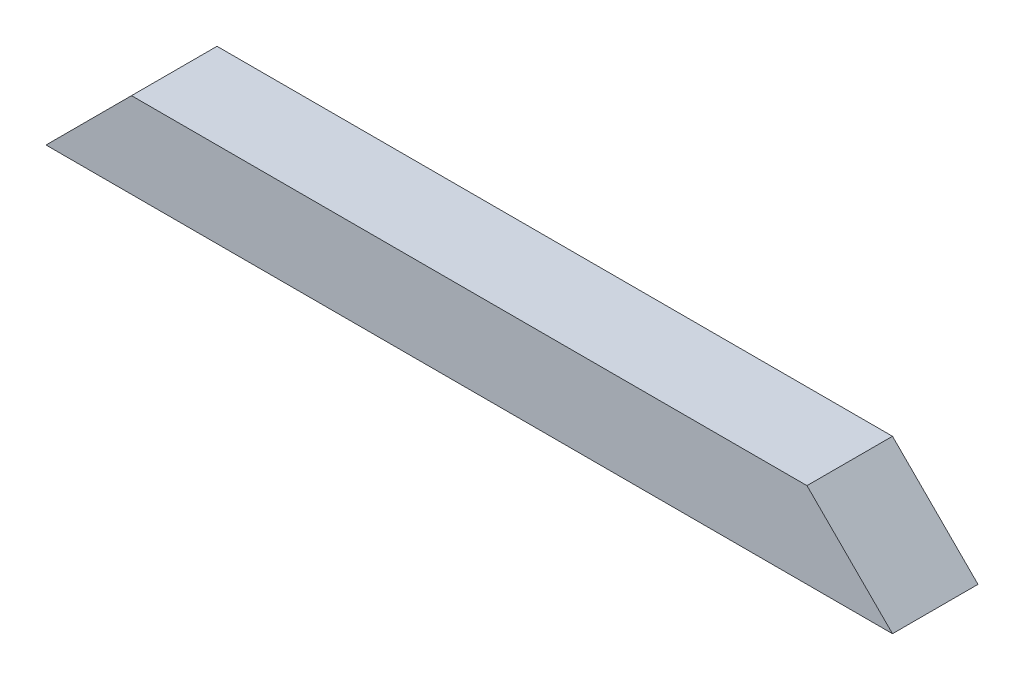
ISO-10303-21;
HEADER;
FILE_DESCRIPTION(('STEP AP214'),'2;1');
FILE_NAME('part.step','',(''),(''),'','','');
FILE_SCHEMA(('AUTOMOTIVE_DESIGN { 1 0 10303 214 1 1 1 1 }'));
ENDSEC;
DATA;
#1=APPLICATION_CONTEXT('core data for automotive mechanical design processes');
#2=APPLICATION_PROTOCOL_DEFINITION('international standard','automotive_design',2000,#1);
#3=PRODUCT_CONTEXT('',#1,'mechanical');
#4=PRODUCT('Part','Part','',(#3));
#5=PRODUCT_RELATED_PRODUCT_CATEGORY('part','',(#4));
#6=PRODUCT_DEFINITION_FORMATION('','',#4);
#7=PRODUCT_DEFINITION_CONTEXT('part definition',#1,'design');
#8=PRODUCT_DEFINITION('design','',#6,#7);
#9=PRODUCT_DEFINITION_SHAPE('','',#8);
#10=(LENGTH_UNIT() NAMED_UNIT(*) SI_UNIT(.MILLI.,.METRE.));
#11=(NAMED_UNIT(*) PLANE_ANGLE_UNIT() SI_UNIT($,.RADIAN.));
#12=(NAMED_UNIT(*) SI_UNIT($,.STERADIAN.) SOLID_ANGLE_UNIT());
#13=UNCERTAINTY_MEASURE_WITH_UNIT(LENGTH_MEASURE(1.E-05),#10,'distance_accuracy_value','');
#14=(GEOMETRIC_REPRESENTATION_CONTEXT(3) GLOBAL_UNCERTAINTY_ASSIGNED_CONTEXT((#13)) GLOBAL_UNIT_ASSIGNED_CONTEXT((#10,
#11,#12)) REPRESENTATION_CONTEXT('',''));
#15=CARTESIAN_POINT('',(0.,0.,0.));
#16=DIRECTION('',(0.,0.,1.));
#17=DIRECTION('',(1.,0.,0.));
#18=AXIS2_PLACEMENT_3D('',#15,#16,#17);
#19=CARTESIAN_POINT('',(40.,40.,40.));
#20=DIRECTION('',(0.707106781186547,-0.707106781186548,0.));
#21=DIRECTION('',(0.707106781186548,0.707106781186547,0.));
#22=AXIS2_PLACEMENT_3D('',#19,#20,#21);
#23=PLANE('',#22);
#24=DIRECTION('',(-0.707106781186548,-0.707106781186547,0.));
#25=VECTOR('',#24,1.);
#26=CARTESIAN_POINT('',(40.,40.,0.));
#27=LINE('',#26,#25);
#28=CARTESIAN_POINT('',(40.,40.,0.));
#29=VERTEX_POINT('',#28);
#30=CARTESIAN_POINT('',(0.,0.,0.));
#31=VERTEX_POINT('',#30);
#32=EDGE_CURVE('E107',#29,#31,#27,.T.);
#33=ORIENTED_EDGE('',*,*,#32,.T.);
#34=DIRECTION('',(0.,0.,-1.));
#35=VECTOR('',#34,1.);
#36=CARTESIAN_POINT('',(0.,0.,40.));
#37=LINE('',#36,#35);
#38=CARTESIAN_POINT('',(0.,0.,40.));
#39=VERTEX_POINT('',#38);
#40=EDGE_CURVE('E11',#39,#31,#37,.T.);
#41=ORIENTED_EDGE('',*,*,#40,.F.);
#42=DIRECTION('',(-0.707106781186548,-0.707106781186547,0.));
#43=VECTOR('',#42,1.);
#44=CARTESIAN_POINT('',(40.,40.,40.));
#45=LINE('',#44,#43);
#46=CARTESIAN_POINT('',(40.,40.,40.));
#47=VERTEX_POINT('',#46);
#48=EDGE_CURVE('E91',#47,#39,#45,.T.);
#49=ORIENTED_EDGE('',*,*,#48,.F.);
#50=DIRECTION('',(0.,0.,-1.));
#51=VECTOR('',#50,1.);
#52=CARTESIAN_POINT('',(40.,40.,40.));
#53=LINE('',#52,#51);
#54=EDGE_CURVE('E103',#47,#29,#53,.T.);
#55=ORIENTED_EDGE('',*,*,#54,.T.);
#56=EDGE_LOOP('',(#33,#41,#49,#55));
#57=FACE_BOUND('',#56,.T.);
#58=ADVANCED_FACE('F39',(#57),#23,.F.);
#59=CARTESIAN_POINT('',(0.,0.,40.));
#60=DIRECTION('',(0.,1.,0.));
#61=DIRECTION('',(0.,0.,1.));
#62=AXIS2_PLACEMENT_3D('',#59,#60,#61);
#63=PLANE('',#62);
#64=DIRECTION('',(1.,0.,0.));
#65=VECTOR('',#64,1.);
#66=CARTESIAN_POINT('',(0.,0.,0.));
#67=LINE('',#66,#65);
#68=CARTESIAN_POINT('',(395.979797,0.,0.));
#69=VERTEX_POINT('',#68);
#70=EDGE_CURVE('E96',#31,#69,#67,.T.);
#71=ORIENTED_EDGE('',*,*,#70,.T.);
#72=DIRECTION('',(0.,0.,-1.));
#73=VECTOR('',#72,1.);
#74=CARTESIAN_POINT('',(395.979797,0.,40.));
#75=LINE('',#74,#73);
#76=CARTESIAN_POINT('',(395.979797,0.,40.));
#77=VERTEX_POINT('',#76);
#78=EDGE_CURVE('E48',#77,#69,#75,.T.);
#79=ORIENTED_EDGE('',*,*,#78,.F.);
#80=DIRECTION('',(1.,0.,0.));
#81=VECTOR('',#80,1.);
#82=CARTESIAN_POINT('',(0.,0.,40.));
#83=LINE('',#82,#81);
#84=EDGE_CURVE('E86',#39,#77,#83,.T.);
#85=ORIENTED_EDGE('',*,*,#84,.F.);
#86=ORIENTED_EDGE('',*,*,#40,.T.);
#87=EDGE_LOOP('',(#71,#79,#85,#86));
#88=FACE_BOUND('',#87,.T.);
#89=ADVANCED_FACE('F95',(#88),#63,.F.);
#90=CARTESIAN_POINT('',(395.979797,0.,40.));
#91=DIRECTION('',(-0.707106781186548,-0.707106781186547,0.));
#92=DIRECTION('',(0.707106781186547,-0.707106781186548,0.));
#93=AXIS2_PLACEMENT_3D('',#90,#91,#92);
#94=PLANE('',#93);
#95=DIRECTION('',(-0.707106781186547,0.707106781186548,0.));
#96=VECTOR('',#95,1.);
#97=CARTESIAN_POINT('',(395.979797,0.,0.));
#98=LINE('',#97,#96);
#99=CARTESIAN_POINT('',(355.979797,40.,0.));
#100=VERTEX_POINT('',#99);
#101=EDGE_CURVE('E73',#69,#100,#98,.T.);
#102=ORIENTED_EDGE('',*,*,#101,.T.);
#103=DIRECTION('',(0.,0.,-1.));
#104=VECTOR('',#103,1.);
#105=CARTESIAN_POINT('',(355.979797,40.,40.));
#106=LINE('',#105,#104);
#107=CARTESIAN_POINT('',(355.979797,40.,40.));
#108=VERTEX_POINT('',#107);
#109=EDGE_CURVE('E98',#108,#100,#106,.T.);
#110=ORIENTED_EDGE('',*,*,#109,.F.);
#111=DIRECTION('',(-0.707106781186547,0.707106781186548,0.));
#112=VECTOR('',#111,1.);
#113=CARTESIAN_POINT('',(395.979797,0.,40.));
#114=LINE('',#113,#112);
#115=EDGE_CURVE('E89',#77,#108,#114,.T.);
#116=ORIENTED_EDGE('',*,*,#115,.F.);
#117=ORIENTED_EDGE('',*,*,#78,.T.);
#118=EDGE_LOOP('',(#102,#110,#116,#117));
#119=FACE_BOUND('',#118,.T.);
#120=ADVANCED_FACE('F99',(#119),#94,.F.);
#121=CARTESIAN_POINT('',(355.979797,40.,40.));
#122=DIRECTION('',(0.,-1.,0.));
#123=DIRECTION('',(1.,0.,0.));
#124=AXIS2_PLACEMENT_3D('',#121,#122,#123);
#125=PLANE('',#124);
#126=DIRECTION('',(-1.,0.,0.));
#127=VECTOR('',#126,1.);
#128=CARTESIAN_POINT('',(355.979797,40.,0.));
#129=LINE('',#128,#127);
#130=EDGE_CURVE('E79',#100,#29,#129,.T.);
#131=ORIENTED_EDGE('',*,*,#130,.T.);
#132=ORIENTED_EDGE('',*,*,#54,.F.);
#133=DIRECTION('',(-1.,0.,0.));
#134=VECTOR('',#133,1.);
#135=CARTESIAN_POINT('',(355.979797,40.,40.));
#136=LINE('',#135,#134);
#137=EDGE_CURVE('E56',#108,#47,#136,.T.);
#138=ORIENTED_EDGE('',*,*,#137,.F.);
#139=ORIENTED_EDGE('',*,*,#109,.T.);
#140=EDGE_LOOP('',(#131,#132,#138,#139));
#141=FACE_BOUND('',#140,.T.);
#142=ADVANCED_FACE('F120',(#141),#125,.F.);
#143=CARTESIAN_POINT('',(0.,0.,40.));
#144=DIRECTION('',(0.,0.,-1.));
#145=DIRECTION('',(-1.,0.,0.));
#146=AXIS2_PLACEMENT_3D('',#143,#144,#145);
#147=PLANE('',#146);
#148=ORIENTED_EDGE('',*,*,#48,.T.);
#149=ORIENTED_EDGE('',*,*,#84,.T.);
#150=ORIENTED_EDGE('',*,*,#115,.T.);
#151=ORIENTED_EDGE('',*,*,#137,.T.);
#152=EDGE_LOOP('',(#148,#149,#150,#151));
#153=FACE_BOUND('',#152,.T.);
#154=ADVANCED_FACE('F87',(#153),#147,.F.);
#155=CARTESIAN_POINT('',(0.,0.,0.));
#156=DIRECTION('',(0.,0.,-1.));
#157=DIRECTION('',(-1.,0.,0.));
#158=AXIS2_PLACEMENT_3D('',#155,#156,#157);
#159=PLANE('',#158);
#160=ORIENTED_EDGE('',*,*,#32,.F.);
#161=ORIENTED_EDGE('',*,*,#130,.F.);
#162=ORIENTED_EDGE('',*,*,#101,.F.);
#163=ORIENTED_EDGE('',*,*,#70,.F.);
#164=EDGE_LOOP('',(#160,#161,#162,#163));
#165=FACE_BOUND('',#164,.T.);
#166=ADVANCED_FACE('F123',(#165),#159,.T.);
#167=CLOSED_SHELL('',(#58,#89,#120,#142,#154,#166));
#168=MANIFOLD_SOLID_BREP('B2',#167);
#169=ADVANCED_BREP_SHAPE_REPRESENTATION('',(#18,#168),#14);
#170=SHAPE_DEFINITION_REPRESENTATION(#9,#169);
ENDSEC;
END-ISO-10303-21;
